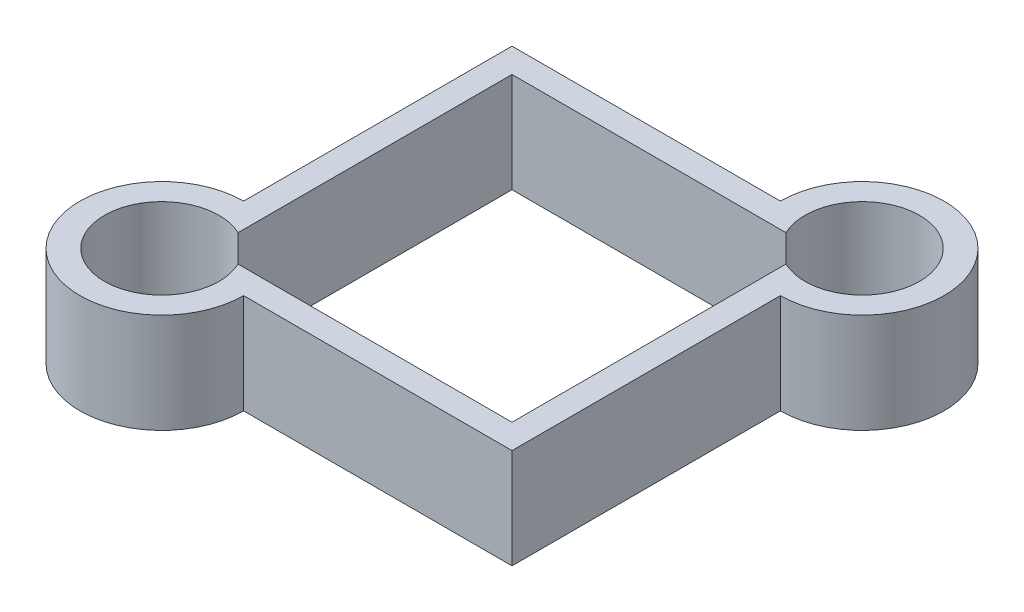
ISO-10303-21;
HEADER;
FILE_DESCRIPTION(('STEP AP214'),'2;1');
FILE_NAME('part.step','',(''),(''),'','','');
FILE_SCHEMA(('AUTOMOTIVE_DESIGN { 1 0 10303 214 1 1 1 1 }'));
ENDSEC;
DATA;
#1=APPLICATION_CONTEXT('core data for automotive mechanical design processes');
#2=APPLICATION_PROTOCOL_DEFINITION('international standard','automotive_design',2000,#1);
#3=PRODUCT_CONTEXT('',#1,'mechanical');
#4=PRODUCT('Part','Part','',(#3));
#5=PRODUCT_RELATED_PRODUCT_CATEGORY('part','',(#4));
#6=PRODUCT_DEFINITION_FORMATION('','',#4);
#7=PRODUCT_DEFINITION_CONTEXT('part definition',#1,'design');
#8=PRODUCT_DEFINITION('design','',#6,#7);
#9=PRODUCT_DEFINITION_SHAPE('','',#8);
#10=(LENGTH_UNIT() NAMED_UNIT(*) SI_UNIT(.MILLI.,.METRE.));
#11=(NAMED_UNIT(*) PLANE_ANGLE_UNIT() SI_UNIT($,.RADIAN.));
#12=(NAMED_UNIT(*) SI_UNIT($,.STERADIAN.) SOLID_ANGLE_UNIT());
#13=UNCERTAINTY_MEASURE_WITH_UNIT(LENGTH_MEASURE(1.E-05),#10,'distance_accuracy_value','');
#14=(GEOMETRIC_REPRESENTATION_CONTEXT(3) GLOBAL_UNCERTAINTY_ASSIGNED_CONTEXT((#13)) GLOBAL_UNIT_ASSIGNED_CONTEXT((#10,
#11,#12)) REPRESENTATION_CONTEXT('',''));
#15=CARTESIAN_POINT('',(0.,0.,0.));
#16=DIRECTION('',(0.,0.,1.));
#17=DIRECTION('',(1.,0.,0.));
#18=AXIS2_PLACEMENT_3D('',#15,#16,#17);
#19=CARTESIAN_POINT('',(0.,61.,0.));
#20=DIRECTION('',(0.,1.,0.));
#21=DIRECTION('',(0.,0.,1.));
#22=AXIS2_PLACEMENT_3D('',#19,#20,#21);
#23=PLANE('',#22);
#24=DIRECTION('',(0.,0.,1.));
#25=VECTOR('',#24,1.);
#26=CARTESIAN_POINT('',(-107.,61.,0.));
#27=LINE('',#26,#25);
#28=CARTESIAN_POINT('',(-107.,61.,-107.));
#29=VERTEX_POINT('',#28);
#30=CARTESIAN_POINT('',(-107.,61.,57.));
#31=VERTEX_POINT('',#30);
#32=EDGE_CURVE('E235',#29,#31,#27,.T.);
#33=ORIENTED_EDGE('',*,*,#32,.T.);
#34=CARTESIAN_POINT('',(-107.,61.,107.));
#35=DIRECTION('',(0.,1.,0.));
#36=DIRECTION('',(0.,0.,1.));
#37=AXIS2_PLACEMENT_3D('',#34,#35,#36);
#38=CIRCLE('',#37,50.);
#39=CARTESIAN_POINT('',(-57.,61.,107.));
#40=VERTEX_POINT('',#39);
#41=EDGE_CURVE('E239',#31,#40,#38,.T.);
#42=ORIENTED_EDGE('',*,*,#41,.T.);
#43=DIRECTION('',(1.,0.,0.));
#44=VECTOR('',#43,1.);
#45=CARTESIAN_POINT('',(0.,61.,107.));
#46=LINE('',#45,#44);
#47=CARTESIAN_POINT('',(107.,61.,107.));
#48=VERTEX_POINT('',#47);
#49=EDGE_CURVE('E243',#40,#48,#46,.T.);
#50=ORIENTED_EDGE('',*,*,#49,.T.);
#51=DIRECTION('',(0.,0.,1.));
#52=VECTOR('',#51,1.);
#53=CARTESIAN_POINT('',(107.,61.,0.));
#54=LINE('',#53,#52);
#55=CARTESIAN_POINT('',(107.,61.,-57.));
#56=VERTEX_POINT('',#55);
#57=EDGE_CURVE('E246',#56,#48,#54,.T.);
#58=ORIENTED_EDGE('',*,*,#57,.F.);
#59=CARTESIAN_POINT('',(107.,61.,-107.));
#60=DIRECTION('',(0.,1.,0.));
#61=DIRECTION('',(0.,0.,1.));
#62=AXIS2_PLACEMENT_3D('',#59,#60,#61);
#63=CIRCLE('',#62,50.);
#64=CARTESIAN_POINT('',(57.,61.,-107.));
#65=VERTEX_POINT('',#64);
#66=EDGE_CURVE('E250',#56,#65,#63,.T.);
#67=ORIENTED_EDGE('',*,*,#66,.T.);
#68=DIRECTION('',(1.,0.,0.));
#69=VECTOR('',#68,1.);
#70=CARTESIAN_POINT('',(0.,61.,-107.));
#71=LINE('',#70,#69);
#72=EDGE_CURVE('E253',#29,#65,#71,.T.);
#73=ORIENTED_EDGE('',*,*,#72,.F.);
#74=EDGE_LOOP('',(#33,#42,#50,#58,#67,#73));
#75=FACE_BOUND('',#74,.T.);
#76=CARTESIAN_POINT('',(-107.,61.,107.));
#77=DIRECTION('',(0.,1.,0.));
#78=DIRECTION('',(0.,0.,1.));
#79=AXIS2_PLACEMENT_3D('',#76,#77,#78);
#80=CIRCLE('',#79,35.);
#81=CARTESIAN_POINT('',(-92.,61.,75.3772233983162));
#82=VERTEX_POINT('',#81);
#83=CARTESIAN_POINT('',(-75.3772233983162,61.,92.));
#84=VERTEX_POINT('',#83);
#85=EDGE_CURVE('E176',#82,#84,#80,.T.);
#86=ORIENTED_EDGE('',*,*,#85,.F.);
#87=DIRECTION('',(0.,0.,1.));
#88=VECTOR('',#87,1.);
#89=CARTESIAN_POINT('',(-92.,61.,-92.));
#90=LINE('',#89,#88);
#91=CARTESIAN_POINT('',(-92.,61.,-92.));
#92=VERTEX_POINT('',#91);
#93=EDGE_CURVE('E167',#92,#82,#90,.T.);
#94=ORIENTED_EDGE('',*,*,#93,.F.);
#95=DIRECTION('',(1.,0.,0.));
#96=VECTOR('',#95,1.);
#97=CARTESIAN_POINT('',(-92.,61.,-92.));
#98=LINE('',#97,#96);
#99=CARTESIAN_POINT('',(75.3772233983162,61.,-92.));
#100=VERTEX_POINT('',#99);
#101=EDGE_CURVE('E202',#92,#100,#98,.T.);
#102=ORIENTED_EDGE('',*,*,#101,.T.);
#103=CARTESIAN_POINT('',(107.,61.,-107.));
#104=DIRECTION('',(0.,1.,0.));
#105=DIRECTION('',(0.,0.,1.));
#106=AXIS2_PLACEMENT_3D('',#103,#104,#105);
#107=CIRCLE('',#106,35.);
#108=CARTESIAN_POINT('',(92.,61.,-75.3772233983162));
#109=VERTEX_POINT('',#108);
#110=EDGE_CURVE('E199',#109,#100,#107,.T.);
#111=ORIENTED_EDGE('',*,*,#110,.F.);
#112=DIRECTION('',(0.,0.,1.));
#113=VECTOR('',#112,1.);
#114=CARTESIAN_POINT('',(92.,61.,-75.3772233983162));
#115=LINE('',#114,#113);
#116=CARTESIAN_POINT('',(92.,61.,92.));
#117=VERTEX_POINT('',#116);
#118=EDGE_CURVE('E194',#109,#117,#115,.T.);
#119=ORIENTED_EDGE('',*,*,#118,.T.);
#120=DIRECTION('',(1.,0.,0.));
#121=VECTOR('',#120,1.);
#122=CARTESIAN_POINT('',(-75.3772233983162,61.,92.));
#123=LINE('',#122,#121);
#124=EDGE_CURVE('E190',#84,#117,#123,.T.);
#125=ORIENTED_EDGE('',*,*,#124,.F.);
#126=EDGE_LOOP('',(#86,#94,#102,#111,#119,#125));
#127=FACE_BOUND('',#126,.T.);
#128=ADVANCED_FACE('F77',(#75,#127),#23,.T.);
#129=CARTESIAN_POINT('',(0.,0.,0.));
#130=DIRECTION('',(0.,1.,0.));
#131=DIRECTION('',(0.,0.,1.));
#132=AXIS2_PLACEMENT_3D('',#129,#130,#131);
#133=PLANE('',#132);
#134=DIRECTION('',(0.,0.,1.));
#135=VECTOR('',#134,1.);
#136=CARTESIAN_POINT('',(-107.,0.,0.));
#137=LINE('',#136,#135);
#138=CARTESIAN_POINT('',(-107.,0.,-107.));
#139=VERTEX_POINT('',#138);
#140=CARTESIAN_POINT('',(-107.,0.,57.));
#141=VERTEX_POINT('',#140);
#142=EDGE_CURVE('E185',#139,#141,#137,.T.);
#143=ORIENTED_EDGE('',*,*,#142,.F.);
#144=DIRECTION('',(1.,0.,0.));
#145=VECTOR('',#144,1.);
#146=CARTESIAN_POINT('',(0.,0.,-107.));
#147=LINE('',#146,#145);
#148=CARTESIAN_POINT('',(57.,0.,-107.));
#149=VERTEX_POINT('',#148);
#150=EDGE_CURVE('E240',#139,#149,#147,.T.);
#151=ORIENTED_EDGE('',*,*,#150,.T.);
#152=CARTESIAN_POINT('',(107.,0.,-107.));
#153=DIRECTION('',(0.,1.,0.));
#154=DIRECTION('',(0.,0.,1.));
#155=AXIS2_PLACEMENT_3D('',#152,#153,#154);
#156=CIRCLE('',#155,50.);
#157=CARTESIAN_POINT('',(107.,0.,-57.));
#158=VERTEX_POINT('',#157);
#159=EDGE_CURVE('E272',#158,#149,#156,.T.);
#160=ORIENTED_EDGE('',*,*,#159,.F.);
#161=DIRECTION('',(0.,0.,1.));
#162=VECTOR('',#161,1.);
#163=CARTESIAN_POINT('',(107.,0.,0.));
#164=LINE('',#163,#162);
#165=CARTESIAN_POINT('',(107.,0.,107.));
#166=VERTEX_POINT('',#165);
#167=EDGE_CURVE('E268',#158,#166,#164,.T.);
#168=ORIENTED_EDGE('',*,*,#167,.T.);
#169=DIRECTION('',(1.,0.,0.));
#170=VECTOR('',#169,1.);
#171=CARTESIAN_POINT('',(0.,0.,107.));
#172=LINE('',#171,#170);
#173=CARTESIAN_POINT('',(-57.,0.,107.));
#174=VERTEX_POINT('',#173);
#175=EDGE_CURVE('E264',#174,#166,#172,.T.);
#176=ORIENTED_EDGE('',*,*,#175,.F.);
#177=CARTESIAN_POINT('',(-107.,0.,107.));
#178=DIRECTION('',(0.,1.,0.));
#179=DIRECTION('',(0.,0.,1.));
#180=AXIS2_PLACEMENT_3D('',#177,#178,#179);
#181=CIRCLE('',#180,50.);
#182=EDGE_CURVE('E261',#141,#174,#181,.T.);
#183=ORIENTED_EDGE('',*,*,#182,.F.);
#184=EDGE_LOOP('',(#143,#151,#160,#168,#176,#183));
#185=FACE_BOUND('',#184,.T.);
#186=DIRECTION('',(0.,0.,1.));
#187=VECTOR('',#186,1.);
#188=CARTESIAN_POINT('',(-92.,0.,-92.));
#189=LINE('',#188,#187);
#190=CARTESIAN_POINT('',(-92.,0.,-92.));
#191=VERTEX_POINT('',#190);
#192=CARTESIAN_POINT('',(-92.,0.,75.3772233983162));
#193=VERTEX_POINT('',#192);
#194=EDGE_CURVE('E101',#191,#193,#189,.T.);
#195=ORIENTED_EDGE('',*,*,#194,.T.);
#196=CARTESIAN_POINT('',(-107.,0.,107.));
#197=DIRECTION('',(0.,1.,0.));
#198=DIRECTION('',(0.,0.,1.));
#199=AXIS2_PLACEMENT_3D('',#196,#197,#198);
#200=CIRCLE('',#199,35.);
#201=CARTESIAN_POINT('',(-75.3772233983162,0.,92.));
#202=VERTEX_POINT('',#201);
#203=EDGE_CURVE('E183',#193,#202,#200,.T.);
#204=ORIENTED_EDGE('',*,*,#203,.T.);
#205=DIRECTION('',(1.,0.,0.));
#206=VECTOR('',#205,1.);
#207=CARTESIAN_POINT('',(-75.3772233983162,0.,92.));
#208=LINE('',#207,#206);
#209=CARTESIAN_POINT('',(92.,0.,92.));
#210=VERTEX_POINT('',#209);
#211=EDGE_CURVE('E209',#202,#210,#208,.T.);
#212=ORIENTED_EDGE('',*,*,#211,.T.);
#213=DIRECTION('',(0.,0.,1.));
#214=VECTOR('',#213,1.);
#215=CARTESIAN_POINT('',(92.,0.,-75.3772233983162));
#216=LINE('',#215,#214);
#217=CARTESIAN_POINT('',(92.,0.,-75.3772233983162));
#218=VERTEX_POINT('',#217);
#219=EDGE_CURVE('E213',#218,#210,#216,.T.);
#220=ORIENTED_EDGE('',*,*,#219,.F.);
#221=CARTESIAN_POINT('',(107.,0.,-107.));
#222=DIRECTION('',(0.,1.,0.));
#223=DIRECTION('',(0.,0.,1.));
#224=AXIS2_PLACEMENT_3D('',#221,#222,#223);
#225=CIRCLE('',#224,35.);
#226=CARTESIAN_POINT('',(75.3772233983162,0.,-92.));
#227=VERTEX_POINT('',#226);
#228=EDGE_CURVE('E217',#218,#227,#225,.T.);
#229=ORIENTED_EDGE('',*,*,#228,.T.);
#230=DIRECTION('',(1.,0.,0.));
#231=VECTOR('',#230,1.);
#232=CARTESIAN_POINT('',(-92.,0.,-92.));
#233=LINE('',#232,#231);
#234=EDGE_CURVE('E177',#191,#227,#233,.T.);
#235=ORIENTED_EDGE('',*,*,#234,.F.);
#236=EDGE_LOOP('',(#195,#204,#212,#220,#229,#235));
#237=FACE_BOUND('',#236,.T.);
#238=ADVANCED_FACE('F300',(#185,#237),#133,.F.);
#239=CARTESIAN_POINT('',(-107.,61.,0.));
#240=DIRECTION('',(1.,0.,0.));
#241=DIRECTION('',(0.,0.,-1.));
#242=AXIS2_PLACEMENT_3D('',#239,#240,#241);
#243=PLANE('',#242);
#244=ORIENTED_EDGE('',*,*,#142,.T.);
#245=DIRECTION('',(0.,-1.,0.));
#246=VECTOR('',#245,1.);
#247=CARTESIAN_POINT('',(-107.,61.,57.));
#248=LINE('',#247,#246);
#249=EDGE_CURVE('E12',#31,#141,#248,.T.);
#250=ORIENTED_EDGE('',*,*,#249,.F.);
#251=ORIENTED_EDGE('',*,*,#32,.F.);
#252=DIRECTION('',(0.,-1.,0.));
#253=VECTOR('',#252,1.);
#254=CARTESIAN_POINT('',(-107.,61.,-107.));
#255=LINE('',#254,#253);
#256=EDGE_CURVE('E257',#29,#139,#255,.T.);
#257=ORIENTED_EDGE('',*,*,#256,.T.);
#258=EDGE_LOOP('',(#244,#250,#251,#257));
#259=FACE_BOUND('',#258,.T.);
#260=ADVANCED_FACE('F79',(#259),#243,.F.);
#261=CARTESIAN_POINT('',(-107.,61.,107.));
#262=DIRECTION('',(0.,-1.,0.));
#263=DIRECTION('',(0.,0.,-1.));
#264=AXIS2_PLACEMENT_3D('',#261,#262,#263);
#265=CYLINDRICAL_SURFACE('',#264,50.);
#266=ORIENTED_EDGE('',*,*,#182,.T.);
#267=DIRECTION('',(0.,-1.,0.));
#268=VECTOR('',#267,1.);
#269=CARTESIAN_POINT('',(-57.,61.,107.));
#270=LINE('',#269,#268);
#271=EDGE_CURVE('E86',#40,#174,#270,.T.);
#272=ORIENTED_EDGE('',*,*,#271,.F.);
#273=ORIENTED_EDGE('',*,*,#41,.F.);
#274=ORIENTED_EDGE('',*,*,#249,.T.);
#275=EDGE_LOOP('',(#266,#272,#273,#274));
#276=FACE_BOUND('',#275,.T.);
#277=ADVANCED_FACE('F313',(#276),#265,.T.);
#278=CARTESIAN_POINT('',(0.,61.,107.));
#279=DIRECTION('',(0.,0.,-1.));
#280=DIRECTION('',(-1.,0.,0.));
#281=AXIS2_PLACEMENT_3D('',#278,#279,#280);
#282=PLANE('',#281);
#283=ORIENTED_EDGE('',*,*,#175,.T.);
#284=DIRECTION('',(0.,-1.,0.));
#285=VECTOR('',#284,1.);
#286=CARTESIAN_POINT('',(107.,61.,107.));
#287=LINE('',#286,#285);
#288=EDGE_CURVE('E287',#48,#166,#287,.T.);
#289=ORIENTED_EDGE('',*,*,#288,.F.);
#290=ORIENTED_EDGE('',*,*,#49,.F.);
#291=ORIENTED_EDGE('',*,*,#271,.T.);
#292=EDGE_LOOP('',(#283,#289,#290,#291));
#293=FACE_BOUND('',#292,.T.);
#294=ADVANCED_FACE('F295',(#293),#282,.F.);
#295=CARTESIAN_POINT('',(107.,61.,0.));
#296=DIRECTION('',(1.,0.,0.));
#297=DIRECTION('',(0.,0.,-1.));
#298=AXIS2_PLACEMENT_3D('',#295,#296,#297);
#299=PLANE('',#298);
#300=ORIENTED_EDGE('',*,*,#167,.F.);
#301=DIRECTION('',(0.,-1.,0.));
#302=VECTOR('',#301,1.);
#303=CARTESIAN_POINT('',(107.,61.,-57.));
#304=LINE('',#303,#302);
#305=EDGE_CURVE('E284',#56,#158,#304,.T.);
#306=ORIENTED_EDGE('',*,*,#305,.F.);
#307=ORIENTED_EDGE('',*,*,#57,.T.);
#308=ORIENTED_EDGE('',*,*,#288,.T.);
#309=EDGE_LOOP('',(#300,#306,#307,#308));
#310=FACE_BOUND('',#309,.T.);
#311=ADVANCED_FACE('F305',(#310),#299,.T.);
#312=CARTESIAN_POINT('',(107.,61.,-107.));
#313=DIRECTION('',(0.,-1.,0.));
#314=DIRECTION('',(0.,0.,-1.));
#315=AXIS2_PLACEMENT_3D('',#312,#313,#314);
#316=CYLINDRICAL_SURFACE('',#315,50.);
#317=ORIENTED_EDGE('',*,*,#159,.T.);
#318=DIRECTION('',(0.,-1.,0.));
#319=VECTOR('',#318,1.);
#320=CARTESIAN_POINT('',(57.,61.,-107.));
#321=LINE('',#320,#319);
#322=EDGE_CURVE('E281',#65,#149,#321,.T.);
#323=ORIENTED_EDGE('',*,*,#322,.F.);
#324=ORIENTED_EDGE('',*,*,#66,.F.);
#325=ORIENTED_EDGE('',*,*,#305,.T.);
#326=EDGE_LOOP('',(#317,#323,#324,#325));
#327=FACE_BOUND('',#326,.T.);
#328=ADVANCED_FACE('F319',(#327),#316,.T.);
#329=CARTESIAN_POINT('',(0.,61.,-107.));
#330=DIRECTION('',(0.,0.,-1.));
#331=DIRECTION('',(-1.,0.,0.));
#332=AXIS2_PLACEMENT_3D('',#329,#330,#331);
#333=PLANE('',#332);
#334=ORIENTED_EDGE('',*,*,#150,.F.);
#335=ORIENTED_EDGE('',*,*,#256,.F.);
#336=ORIENTED_EDGE('',*,*,#72,.T.);
#337=ORIENTED_EDGE('',*,*,#322,.T.);
#338=EDGE_LOOP('',(#334,#335,#336,#337));
#339=FACE_BOUND('',#338,.T.);
#340=ADVANCED_FACE('F317',(#339),#333,.T.);
#341=CARTESIAN_POINT('',(-92.,61.,-92.));
#342=DIRECTION('',(1.,0.,0.));
#343=DIRECTION('',(0.,0.,-1.));
#344=AXIS2_PLACEMENT_3D('',#341,#342,#343);
#345=PLANE('',#344);
#346=ORIENTED_EDGE('',*,*,#194,.F.);
#347=DIRECTION('',(0.,-1.,0.));
#348=VECTOR('',#347,1.);
#349=CARTESIAN_POINT('',(-92.,61.,-92.));
#350=LINE('',#349,#348);
#351=EDGE_CURVE('E171',#92,#191,#350,.T.);
#352=ORIENTED_EDGE('',*,*,#351,.F.);
#353=ORIENTED_EDGE('',*,*,#93,.T.);
#354=DIRECTION('',(0.,-1.,0.));
#355=VECTOR('',#354,1.);
#356=CARTESIAN_POINT('',(-92.,61.,75.3772233983162));
#357=LINE('',#356,#355);
#358=EDGE_CURVE('E170',#82,#193,#357,.T.);
#359=ORIENTED_EDGE('',*,*,#358,.T.);
#360=EDGE_LOOP('',(#346,#352,#353,#359));
#361=FACE_BOUND('',#360,.T.);
#362=ADVANCED_FACE('F169',(#361),#345,.T.);
#363=CARTESIAN_POINT('',(-107.,61.,107.));
#364=DIRECTION('',(0.,-1.,0.));
#365=DIRECTION('',(0.,0.,-1.));
#366=AXIS2_PLACEMENT_3D('',#363,#364,#365);
#367=CYLINDRICAL_SURFACE('',#366,35.);
#368=ORIENTED_EDGE('',*,*,#203,.F.);
#369=ORIENTED_EDGE('',*,*,#358,.F.);
#370=ORIENTED_EDGE('',*,*,#85,.T.);
#371=DIRECTION('',(0.,-1.,0.));
#372=VECTOR('',#371,1.);
#373=CARTESIAN_POINT('',(-75.3772233983162,61.,92.));
#374=LINE('',#373,#372);
#375=EDGE_CURVE('E186',#84,#202,#374,.T.);
#376=ORIENTED_EDGE('',*,*,#375,.T.);
#377=EDGE_LOOP('',(#368,#369,#370,#376));
#378=FACE_BOUND('',#377,.T.);
#379=ADVANCED_FACE('F180',(#378),#367,.F.);
#380=CARTESIAN_POINT('',(-75.3772233983162,61.,92.));
#381=DIRECTION('',(0.,0.,-1.));
#382=DIRECTION('',(-1.,0.,0.));
#383=AXIS2_PLACEMENT_3D('',#380,#381,#382);
#384=PLANE('',#383);
#385=ORIENTED_EDGE('',*,*,#211,.F.);
#386=ORIENTED_EDGE('',*,*,#375,.F.);
#387=ORIENTED_EDGE('',*,*,#124,.T.);
#388=DIRECTION('',(0.,-1.,0.));
#389=VECTOR('',#388,1.);
#390=CARTESIAN_POINT('',(92.,61.,92.));
#391=LINE('',#390,#389);
#392=EDGE_CURVE('E230',#117,#210,#391,.T.);
#393=ORIENTED_EDGE('',*,*,#392,.T.);
#394=EDGE_LOOP('',(#385,#386,#387,#393));
#395=FACE_BOUND('',#394,.T.);
#396=ADVANCED_FACE('F339',(#395),#384,.T.);
#397=CARTESIAN_POINT('',(92.,61.,-75.3772233983162));
#398=DIRECTION('',(1.,0.,0.));
#399=DIRECTION('',(0.,0.,-1.));
#400=AXIS2_PLACEMENT_3D('',#397,#398,#399);
#401=PLANE('',#400);
#402=ORIENTED_EDGE('',*,*,#219,.T.);
#403=ORIENTED_EDGE('',*,*,#392,.F.);
#404=ORIENTED_EDGE('',*,*,#118,.F.);
#405=DIRECTION('',(0.,-1.,0.));
#406=VECTOR('',#405,1.);
#407=CARTESIAN_POINT('',(92.,61.,-75.3772233983162));
#408=LINE('',#407,#406);
#409=EDGE_CURVE('E227',#109,#218,#408,.T.);
#410=ORIENTED_EDGE('',*,*,#409,.T.);
#411=EDGE_LOOP('',(#402,#403,#404,#410));
#412=FACE_BOUND('',#411,.T.);
#413=ADVANCED_FACE('F342',(#412),#401,.F.);
#414=CARTESIAN_POINT('',(107.,61.,-107.));
#415=DIRECTION('',(0.,-1.,0.));
#416=DIRECTION('',(0.,0.,-1.));
#417=AXIS2_PLACEMENT_3D('',#414,#415,#416);
#418=CYLINDRICAL_SURFACE('',#417,35.);
#419=ORIENTED_EDGE('',*,*,#228,.F.);
#420=ORIENTED_EDGE('',*,*,#409,.F.);
#421=ORIENTED_EDGE('',*,*,#110,.T.);
#422=DIRECTION('',(0.,-1.,0.));
#423=VECTOR('',#422,1.);
#424=CARTESIAN_POINT('',(75.3772233983162,61.,-92.));
#425=LINE('',#424,#423);
#426=EDGE_CURVE('E93',#100,#227,#425,.T.);
#427=ORIENTED_EDGE('',*,*,#426,.T.);
#428=EDGE_LOOP('',(#419,#420,#421,#427));
#429=FACE_BOUND('',#428,.T.);
#430=ADVANCED_FACE('F346',(#429),#418,.F.);
#431=CARTESIAN_POINT('',(-92.,61.,-92.));
#432=DIRECTION('',(0.,0.,-1.));
#433=DIRECTION('',(-1.,0.,0.));
#434=AXIS2_PLACEMENT_3D('',#431,#432,#433);
#435=PLANE('',#434);
#436=ORIENTED_EDGE('',*,*,#234,.T.);
#437=ORIENTED_EDGE('',*,*,#426,.F.);
#438=ORIENTED_EDGE('',*,*,#101,.F.);
#439=ORIENTED_EDGE('',*,*,#351,.T.);
#440=EDGE_LOOP('',(#436,#437,#438,#439));
#441=FACE_BOUND('',#440,.T.);
#442=ADVANCED_FACE('F350',(#441),#435,.F.);
#443=CLOSED_SHELL('',(#128,#238,#260,#277,#294,#311,#328,#340,#362,#379,#396,#413,#430,#442));
#444=MANIFOLD_SOLID_BREP('B2',#443);
#445=ADVANCED_BREP_SHAPE_REPRESENTATION('',(#18,#444),#14);
#446=SHAPE_DEFINITION_REPRESENTATION(#9,#445);
ENDSEC;
END-ISO-10303-21;
